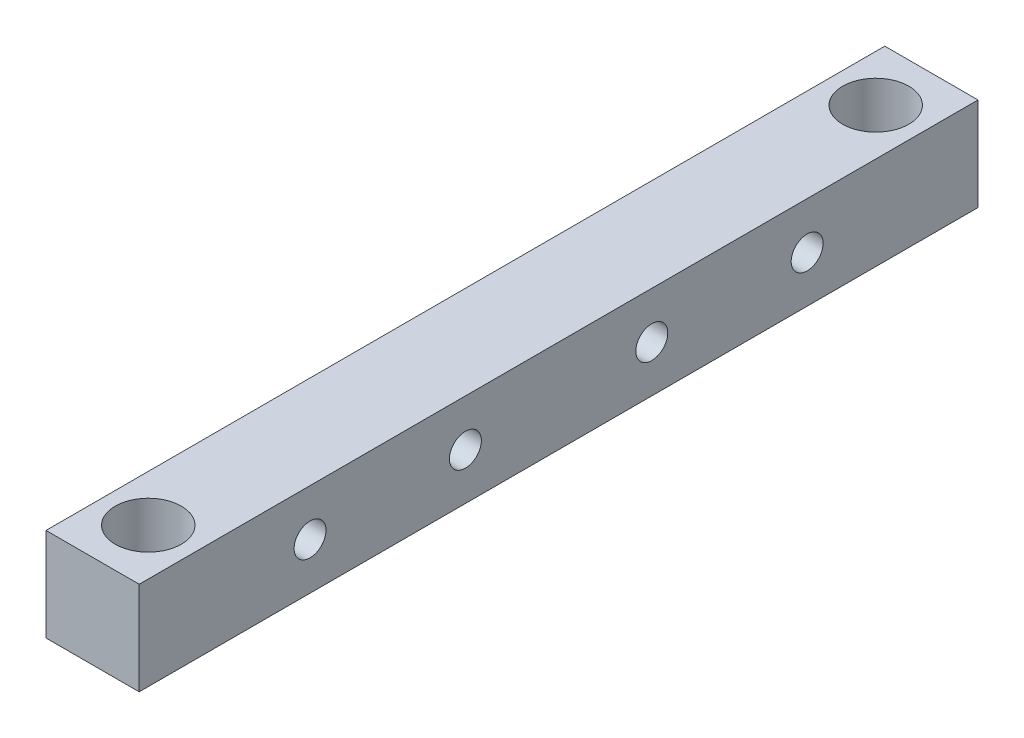
ISO-10303-21;
HEADER;
FILE_DESCRIPTION(('STEP AP214'),'2;1');
FILE_NAME('part.step','',(''),(''),'','','');
FILE_SCHEMA(('AUTOMOTIVE_DESIGN { 1 0 10303 214 1 1 1 1 }'));
ENDSEC;
DATA;
#1=APPLICATION_CONTEXT('core data for automotive mechanical design processes');
#2=APPLICATION_PROTOCOL_DEFINITION('international standard','automotive_design',2000,#1);
#3=PRODUCT_CONTEXT('',#1,'mechanical');
#4=PRODUCT('Part','Part','',(#3));
#5=PRODUCT_RELATED_PRODUCT_CATEGORY('part','',(#4));
#6=PRODUCT_DEFINITION_FORMATION('','',#4);
#7=PRODUCT_DEFINITION_CONTEXT('part definition',#1,'design');
#8=PRODUCT_DEFINITION('design','',#6,#7);
#9=PRODUCT_DEFINITION_SHAPE('','',#8);
#10=(LENGTH_UNIT() NAMED_UNIT(*) SI_UNIT(.MILLI.,.METRE.));
#11=(NAMED_UNIT(*) PLANE_ANGLE_UNIT() SI_UNIT($,.RADIAN.));
#12=(NAMED_UNIT(*) SI_UNIT($,.STERADIAN.) SOLID_ANGLE_UNIT());
#13=UNCERTAINTY_MEASURE_WITH_UNIT(LENGTH_MEASURE(1.E-05),#10,'distance_accuracy_value','');
#14=(GEOMETRIC_REPRESENTATION_CONTEXT(3) GLOBAL_UNCERTAINTY_ASSIGNED_CONTEXT((#13)) GLOBAL_UNIT_ASSIGNED_CONTEXT((#10,
#11,#12)) REPRESENTATION_CONTEXT('',''));
#15=CARTESIAN_POINT('',(0.,0.,0.));
#16=DIRECTION('',(0.,0.,1.));
#17=DIRECTION('',(1.,0.,0.));
#18=AXIS2_PLACEMENT_3D('',#15,#16,#17);
#19=CARTESIAN_POINT('',(4.7625,-4.7625,42.8625));
#20=DIRECTION('',(-1.,0.,0.));
#21=DIRECTION('',(0.,0.,1.));
#22=AXIS2_PLACEMENT_3D('',#19,#20,#21);
#23=PLANE('',#22);
#24=CARTESIAN_POINT('',(4.7625,0.,9.525));
#25=DIRECTION('',(1.,0.,0.));
#26=DIRECTION('',(0.,0.,-1.));
#27=AXIS2_PLACEMENT_3D('',#24,#25,#26);
#28=CIRCLE('',#27,1.63194999999999);
#29=CARTESIAN_POINT('',(4.7625,0.,7.89305000000001));
#30=VERTEX_POINT('',#29);
#31=EDGE_CURVE('E144',#30,#30,#28,.T.);
#32=ORIENTED_EDGE('',*,*,#31,.F.);
#33=EDGE_LOOP('',(#32));
#34=FACE_BOUND('',#33,.T.);
#35=CARTESIAN_POINT('',(4.7625,0.,25.4));
#36=DIRECTION('',(1.,0.,0.));
#37=DIRECTION('',(0.,0.,-1.));
#38=AXIS2_PLACEMENT_3D('',#35,#36,#37);
#39=CIRCLE('',#38,1.63194999999999);
#40=CARTESIAN_POINT('',(4.7625,0.,23.76805));
#41=VERTEX_POINT('',#40);
#42=EDGE_CURVE('E138',#41,#41,#39,.T.);
#43=ORIENTED_EDGE('',*,*,#42,.F.);
#44=EDGE_LOOP('',(#43));
#45=FACE_BOUND('',#44,.T.);
#46=CARTESIAN_POINT('',(4.7625,0.,-9.525));
#47=DIRECTION('',(1.,0.,0.));
#48=DIRECTION('',(0.,0.,-1.));
#49=AXIS2_PLACEMENT_3D('',#46,#47,#48);
#50=CIRCLE('',#49,1.63194999999999);
#51=CARTESIAN_POINT('',(4.7625,0.,-11.15695));
#52=VERTEX_POINT('',#51);
#53=EDGE_CURVE('E132',#52,#52,#50,.T.);
#54=ORIENTED_EDGE('',*,*,#53,.F.);
#55=EDGE_LOOP('',(#54));
#56=FACE_BOUND('',#55,.T.);
#57=CARTESIAN_POINT('',(4.7625,0.,-25.4));
#58=DIRECTION('',(1.,0.,0.));
#59=DIRECTION('',(0.,0.,-1.));
#60=AXIS2_PLACEMENT_3D('',#57,#58,#59);
#61=CIRCLE('',#60,1.63194999999999);
#62=CARTESIAN_POINT('',(4.7625,0.,-27.03195));
#63=VERTEX_POINT('',#62);
#64=EDGE_CURVE('E126',#63,#63,#61,.T.);
#65=ORIENTED_EDGE('',*,*,#64,.F.);
#66=EDGE_LOOP('',(#65));
#67=FACE_BOUND('',#66,.T.);
#68=DIRECTION('',(0.,1.,0.));
#69=VECTOR('',#68,1.);
#70=CARTESIAN_POINT('',(4.7625,-4.7625,-42.8625));
#71=LINE('',#70,#69);
#72=CARTESIAN_POINT('',(4.7625,-4.7625,-42.8625));
#73=VERTEX_POINT('',#72);
#74=CARTESIAN_POINT('',(4.7625,4.7625,-42.8625));
#75=VERTEX_POINT('',#74);
#76=EDGE_CURVE('E98',#73,#75,#71,.T.);
#77=ORIENTED_EDGE('',*,*,#76,.T.);
#78=DIRECTION('',(0.,0.,-1.));
#79=VECTOR('',#78,1.);
#80=CARTESIAN_POINT('',(4.7625,4.7625,42.8625));
#81=LINE('',#80,#79);
#82=CARTESIAN_POINT('',(4.7625,4.7625,42.8625));
#83=VERTEX_POINT('',#82);
#84=EDGE_CURVE('E11',#83,#75,#81,.T.);
#85=ORIENTED_EDGE('',*,*,#84,.F.);
#86=DIRECTION('',(0.,1.,0.));
#87=VECTOR('',#86,1.);
#88=CARTESIAN_POINT('',(4.7625,-4.7625,42.8625));
#89=LINE('',#88,#87);
#90=CARTESIAN_POINT('',(4.7625,-4.7625,42.8625));
#91=VERTEX_POINT('',#90);
#92=EDGE_CURVE('E86',#91,#83,#89,.T.);
#93=ORIENTED_EDGE('',*,*,#92,.F.);
#94=DIRECTION('',(0.,0.,-1.));
#95=VECTOR('',#94,1.);
#96=CARTESIAN_POINT('',(4.7625,-4.7625,42.8625));
#97=LINE('',#96,#95);
#98=EDGE_CURVE('E94',#91,#73,#97,.T.);
#99=ORIENTED_EDGE('',*,*,#98,.T.);
#100=EDGE_LOOP('',(#77,#85,#93,#99));
#101=FACE_BOUND('',#100,.T.);
#102=ADVANCED_FACE('F35',(#34,#45,#56,#67,#101),#23,.F.);
#103=CARTESIAN_POINT('',(-4.7625,4.7625,42.8625));
#104=DIRECTION('',(0.,-1.,0.));
#105=DIRECTION('',(0.,0.,-1.));
#106=AXIS2_PLACEMENT_3D('',#103,#104,#105);
#107=PLANE('',#106);
#108=CARTESIAN_POINT('',(0.,4.7625,37.1729));
#109=DIRECTION('',(0.,1.,0.));
#110=DIRECTION('',(0.,0.,1.));
#111=AXIS2_PLACEMENT_3D('',#108,#109,#110);
#112=CIRCLE('',#111,3.37819999999999);
#113=CARTESIAN_POINT('',(0.,4.7625,40.5511));
#114=VERTEX_POINT('',#113);
#115=EDGE_CURVE('E120',#114,#114,#112,.T.);
#116=ORIENTED_EDGE('',*,*,#115,.F.);
#117=EDGE_LOOP('',(#116));
#118=FACE_BOUND('',#117,.T.);
#119=CARTESIAN_POINT('',(0.,4.7625,-37.1729));
#120=DIRECTION('',(0.,1.,0.));
#121=DIRECTION('',(0.,0.,1.));
#122=AXIS2_PLACEMENT_3D('',#119,#120,#121);
#123=CIRCLE('',#122,3.37819999999999);
#124=CARTESIAN_POINT('',(0.,4.7625,-33.7947));
#125=VERTEX_POINT('',#124);
#126=EDGE_CURVE('E114',#125,#125,#123,.T.);
#127=ORIENTED_EDGE('',*,*,#126,.F.);
#128=EDGE_LOOP('',(#127));
#129=FACE_BOUND('',#128,.T.);
#130=DIRECTION('',(-1.,0.,0.));
#131=VECTOR('',#130,1.);
#132=CARTESIAN_POINT('',(-4.7625,4.7625,-42.8625));
#133=LINE('',#132,#131);
#134=CARTESIAN_POINT('',(-4.7625,4.7625,-42.8625));
#135=VERTEX_POINT('',#134);
#136=EDGE_CURVE('E90',#75,#135,#133,.T.);
#137=ORIENTED_EDGE('',*,*,#136,.T.);
#138=DIRECTION('',(0.,0.,-1.));
#139=VECTOR('',#138,1.);
#140=CARTESIAN_POINT('',(-4.7625,4.7625,42.8625));
#141=LINE('',#140,#139);
#142=CARTESIAN_POINT('',(-4.7625,4.7625,42.8625));
#143=VERTEX_POINT('',#142);
#144=EDGE_CURVE('E43',#143,#135,#141,.T.);
#145=ORIENTED_EDGE('',*,*,#144,.F.);
#146=DIRECTION('',(-1.,0.,0.));
#147=VECTOR('',#146,1.);
#148=CARTESIAN_POINT('',(-4.7625,4.7625,42.8625));
#149=LINE('',#148,#147);
#150=EDGE_CURVE('E81',#83,#143,#149,.T.);
#151=ORIENTED_EDGE('',*,*,#150,.F.);
#152=ORIENTED_EDGE('',*,*,#84,.T.);
#153=EDGE_LOOP('',(#137,#145,#151,#152));
#154=FACE_BOUND('',#153,.T.);
#155=ADVANCED_FACE('F89',(#118,#129,#154),#107,.F.);
#156=CARTESIAN_POINT('',(-4.7625,-4.7625,42.8625));
#157=DIRECTION('',(1.,0.,0.));
#158=DIRECTION('',(0.,0.,-1.));
#159=AXIS2_PLACEMENT_3D('',#156,#157,#158);
#160=PLANE('',#159);
#161=CARTESIAN_POINT('',(-4.7625,0.,9.525));
#162=DIRECTION('',(1.,0.,0.));
#163=DIRECTION('',(0.,0.,-1.));
#164=AXIS2_PLACEMENT_3D('',#161,#162,#163);
#165=CIRCLE('',#164,1.63195);
#166=CARTESIAN_POINT('',(-4.7625,0.,7.89305));
#167=VERTEX_POINT('',#166);
#168=EDGE_CURVE('E141',#167,#167,#165,.T.);
#169=ORIENTED_EDGE('',*,*,#168,.T.);
#170=EDGE_LOOP('',(#169));
#171=FACE_BOUND('',#170,.T.);
#172=CARTESIAN_POINT('',(-4.7625,0.,25.4));
#173=DIRECTION('',(1.,0.,0.));
#174=DIRECTION('',(0.,0.,-1.));
#175=AXIS2_PLACEMENT_3D('',#172,#173,#174);
#176=CIRCLE('',#175,1.63195);
#177=CARTESIAN_POINT('',(-4.7625,0.,23.76805));
#178=VERTEX_POINT('',#177);
#179=EDGE_CURVE('E135',#178,#178,#176,.T.);
#180=ORIENTED_EDGE('',*,*,#179,.T.);
#181=EDGE_LOOP('',(#180));
#182=FACE_BOUND('',#181,.T.);
#183=CARTESIAN_POINT('',(-4.7625,0.,-9.525));
#184=DIRECTION('',(1.,0.,0.));
#185=DIRECTION('',(0.,0.,-1.));
#186=AXIS2_PLACEMENT_3D('',#183,#184,#185);
#187=CIRCLE('',#186,1.63195);
#188=CARTESIAN_POINT('',(-4.7625,0.,-11.15695));
#189=VERTEX_POINT('',#188);
#190=EDGE_CURVE('E129',#189,#189,#187,.T.);
#191=ORIENTED_EDGE('',*,*,#190,.T.);
#192=EDGE_LOOP('',(#191));
#193=FACE_BOUND('',#192,.T.);
#194=CARTESIAN_POINT('',(-4.7625,0.,-25.4));
#195=DIRECTION('',(1.,0.,0.));
#196=DIRECTION('',(0.,0.,-1.));
#197=AXIS2_PLACEMENT_3D('',#194,#195,#196);
#198=CIRCLE('',#197,1.63195);
#199=CARTESIAN_POINT('',(-4.7625,0.,-27.03195));
#200=VERTEX_POINT('',#199);
#201=EDGE_CURVE('E123',#200,#200,#198,.T.);
#202=ORIENTED_EDGE('',*,*,#201,.T.);
#203=EDGE_LOOP('',(#202));
#204=FACE_BOUND('',#203,.T.);
#205=DIRECTION('',(0.,-1.,0.));
#206=VECTOR('',#205,1.);
#207=CARTESIAN_POINT('',(-4.7625,-4.7625,-42.8625));
#208=LINE('',#207,#206);
#209=CARTESIAN_POINT('',(-4.7625,-4.7625,-42.8625));
#210=VERTEX_POINT('',#209);
#211=EDGE_CURVE('E68',#135,#210,#208,.T.);
#212=ORIENTED_EDGE('',*,*,#211,.T.);
#213=DIRECTION('',(0.,0.,-1.));
#214=VECTOR('',#213,1.);
#215=CARTESIAN_POINT('',(-4.7625,-4.7625,42.8625));
#216=LINE('',#215,#214);
#217=CARTESIAN_POINT('',(-4.7625,-4.7625,42.8625));
#218=VERTEX_POINT('',#217);
#219=EDGE_CURVE('E91',#218,#210,#216,.T.);
#220=ORIENTED_EDGE('',*,*,#219,.F.);
#221=DIRECTION('',(0.,-1.,0.));
#222=VECTOR('',#221,1.);
#223=CARTESIAN_POINT('',(-4.7625,-4.7625,42.8625));
#224=LINE('',#223,#222);
#225=EDGE_CURVE('E84',#143,#218,#224,.T.);
#226=ORIENTED_EDGE('',*,*,#225,.F.);
#227=ORIENTED_EDGE('',*,*,#144,.T.);
#228=EDGE_LOOP('',(#212,#220,#226,#227));
#229=FACE_BOUND('',#228,.T.);
#230=ADVANCED_FACE('F92',(#171,#182,#193,#204,#229),#160,.F.);
#231=CARTESIAN_POINT('',(-4.7625,-4.7625,42.8625));
#232=DIRECTION('',(0.,1.,0.));
#233=DIRECTION('',(0.,0.,1.));
#234=AXIS2_PLACEMENT_3D('',#231,#232,#233);
#235=PLANE('',#234);
#236=CARTESIAN_POINT('',(0.,-4.7625,37.1729));
#237=DIRECTION('',(0.,1.,0.));
#238=DIRECTION('',(0.,0.,1.));
#239=AXIS2_PLACEMENT_3D('',#236,#237,#238);
#240=CIRCLE('',#239,3.3782);
#241=CARTESIAN_POINT('',(0.,-4.7625,40.5511));
#242=VERTEX_POINT('',#241);
#243=EDGE_CURVE('E117',#242,#242,#240,.T.);
#244=ORIENTED_EDGE('',*,*,#243,.T.);
#245=EDGE_LOOP('',(#244));
#246=FACE_BOUND('',#245,.T.);
#247=CARTESIAN_POINT('',(0.,-4.7625,-37.1729));
#248=DIRECTION('',(0.,1.,0.));
#249=DIRECTION('',(0.,0.,1.));
#250=AXIS2_PLACEMENT_3D('',#247,#248,#249);
#251=CIRCLE('',#250,3.3782);
#252=CARTESIAN_POINT('',(0.,-4.7625,-33.7947));
#253=VERTEX_POINT('',#252);
#254=EDGE_CURVE('E101',#253,#253,#251,.T.);
#255=ORIENTED_EDGE('',*,*,#254,.T.);
#256=EDGE_LOOP('',(#255));
#257=FACE_BOUND('',#256,.T.);
#258=DIRECTION('',(1.,0.,0.));
#259=VECTOR('',#258,1.);
#260=CARTESIAN_POINT('',(-4.7625,-4.7625,-42.8625));
#261=LINE('',#260,#259);
#262=EDGE_CURVE('E74',#210,#73,#261,.T.);
#263=ORIENTED_EDGE('',*,*,#262,.T.);
#264=ORIENTED_EDGE('',*,*,#98,.F.);
#265=DIRECTION('',(1.,0.,0.));
#266=VECTOR('',#265,1.);
#267=CARTESIAN_POINT('',(-4.7625,-4.7625,42.8625));
#268=LINE('',#267,#266);
#269=EDGE_CURVE('E51',#218,#91,#268,.T.);
#270=ORIENTED_EDGE('',*,*,#269,.F.);
#271=ORIENTED_EDGE('',*,*,#219,.T.);
#272=EDGE_LOOP('',(#263,#264,#270,#271));
#273=FACE_BOUND('',#272,.T.);
#274=ADVANCED_FACE('F106',(#246,#257,#273),#235,.F.);
#275=CARTESIAN_POINT('',(0.,0.,42.8625));
#276=DIRECTION('',(0.,0.,-1.));
#277=DIRECTION('',(-1.,0.,0.));
#278=AXIS2_PLACEMENT_3D('',#275,#276,#277);
#279=PLANE('',#278);
#280=ORIENTED_EDGE('',*,*,#92,.T.);
#281=ORIENTED_EDGE('',*,*,#150,.T.);
#282=ORIENTED_EDGE('',*,*,#225,.T.);
#283=ORIENTED_EDGE('',*,*,#269,.T.);
#284=EDGE_LOOP('',(#280,#281,#282,#283));
#285=FACE_BOUND('',#284,.T.);
#286=ADVANCED_FACE('F82',(#285),#279,.F.);
#287=CARTESIAN_POINT('',(0.,0.,-42.8625));
#288=DIRECTION('',(0.,0.,-1.));
#289=DIRECTION('',(-1.,0.,0.));
#290=AXIS2_PLACEMENT_3D('',#287,#288,#289);
#291=PLANE('',#290);
#292=ORIENTED_EDGE('',*,*,#76,.F.);
#293=ORIENTED_EDGE('',*,*,#262,.F.);
#294=ORIENTED_EDGE('',*,*,#211,.F.);
#295=ORIENTED_EDGE('',*,*,#136,.F.);
#296=EDGE_LOOP('',(#292,#293,#294,#295));
#297=FACE_BOUND('',#296,.T.);
#298=ADVANCED_FACE('F109',(#297),#291,.T.);
#299=CARTESIAN_POINT('',(0.,4.7625,-37.1729));
#300=DIRECTION('',(0.,1.,0.));
#301=DIRECTION('',(0.,0.,1.));
#302=AXIS2_PLACEMENT_3D('',#299,#300,#301);
#303=CYLINDRICAL_SURFACE('',#302,3.37819999999999);
#304=ORIENTED_EDGE('',*,*,#254,.F.);
#305=EDGE_LOOP('',(#304));
#306=FACE_BOUND('',#305,.T.);
#307=ORIENTED_EDGE('',*,*,#126,.T.);
#308=EDGE_LOOP('',(#307));
#309=FACE_BOUND('',#308,.T.);
#310=ADVANCED_FACE('F171',(#306,#309),#303,.F.);
#311=CARTESIAN_POINT('',(0.,4.7625,37.1729));
#312=DIRECTION('',(0.,1.,0.));
#313=DIRECTION('',(0.,0.,1.));
#314=AXIS2_PLACEMENT_3D('',#311,#312,#313);
#315=CYLINDRICAL_SURFACE('',#314,3.37819999999999);
#316=ORIENTED_EDGE('',*,*,#243,.F.);
#317=EDGE_LOOP('',(#316));
#318=FACE_BOUND('',#317,.T.);
#319=ORIENTED_EDGE('',*,*,#115,.T.);
#320=EDGE_LOOP('',(#319));
#321=FACE_BOUND('',#320,.T.);
#322=ADVANCED_FACE('F161',(#318,#321),#315,.F.);
#323=CARTESIAN_POINT('',(4.7625,0.,-25.4));
#324=DIRECTION('',(1.,0.,0.));
#325=DIRECTION('',(0.,0.,-1.));
#326=AXIS2_PLACEMENT_3D('',#323,#324,#325);
#327=CYLINDRICAL_SURFACE('',#326,1.63194999999999);
#328=ORIENTED_EDGE('',*,*,#201,.F.);
#329=EDGE_LOOP('',(#328));
#330=FACE_BOUND('',#329,.T.);
#331=ORIENTED_EDGE('',*,*,#64,.T.);
#332=EDGE_LOOP('',(#331));
#333=FACE_BOUND('',#332,.T.);
#334=ADVANCED_FACE('F158',(#330,#333),#327,.F.);
#335=CARTESIAN_POINT('',(4.7625,0.,-9.525));
#336=DIRECTION('',(1.,0.,0.));
#337=DIRECTION('',(0.,0.,-1.));
#338=AXIS2_PLACEMENT_3D('',#335,#336,#337);
#339=CYLINDRICAL_SURFACE('',#338,1.63194999999999);
#340=ORIENTED_EDGE('',*,*,#190,.F.);
#341=EDGE_LOOP('',(#340));
#342=FACE_BOUND('',#341,.T.);
#343=ORIENTED_EDGE('',*,*,#53,.T.);
#344=EDGE_LOOP('',(#343));
#345=FACE_BOUND('',#344,.T.);
#346=ADVANCED_FACE('F160',(#342,#345),#339,.F.);
#347=CARTESIAN_POINT('',(4.7625,0.,25.4));
#348=DIRECTION('',(1.,0.,0.));
#349=DIRECTION('',(0.,0.,-1.));
#350=AXIS2_PLACEMENT_3D('',#347,#348,#349);
#351=CYLINDRICAL_SURFACE('',#350,1.63194999999999);
#352=ORIENTED_EDGE('',*,*,#179,.F.);
#353=EDGE_LOOP('',(#352));
#354=FACE_BOUND('',#353,.T.);
#355=ORIENTED_EDGE('',*,*,#42,.T.);
#356=EDGE_LOOP('',(#355));
#357=FACE_BOUND('',#356,.T.);
#358=ADVANCED_FACE('F168',(#354,#357),#351,.F.);
#359=CARTESIAN_POINT('',(4.7625,0.,9.525));
#360=DIRECTION('',(1.,0.,0.));
#361=DIRECTION('',(0.,0.,-1.));
#362=AXIS2_PLACEMENT_3D('',#359,#360,#361);
#363=CYLINDRICAL_SURFACE('',#362,1.63194999999999);
#364=ORIENTED_EDGE('',*,*,#168,.F.);
#365=EDGE_LOOP('',(#364));
#366=FACE_BOUND('',#365,.T.);
#367=ORIENTED_EDGE('',*,*,#31,.T.);
#368=EDGE_LOOP('',(#367));
#369=FACE_BOUND('',#368,.T.);
#370=ADVANCED_FACE('F148',(#366,#369),#363,.F.);
#371=CLOSED_SHELL('',(#102,#155,#230,#274,#286,#298,#310,#322,#334,#346,#358,#370));
#372=MANIFOLD_SOLID_BREP('B2',#371);
#373=ADVANCED_BREP_SHAPE_REPRESENTATION('',(#18,#372),#14);
#374=SHAPE_DEFINITION_REPRESENTATION(#9,#373);
ENDSEC;
END-ISO-10303-21;
